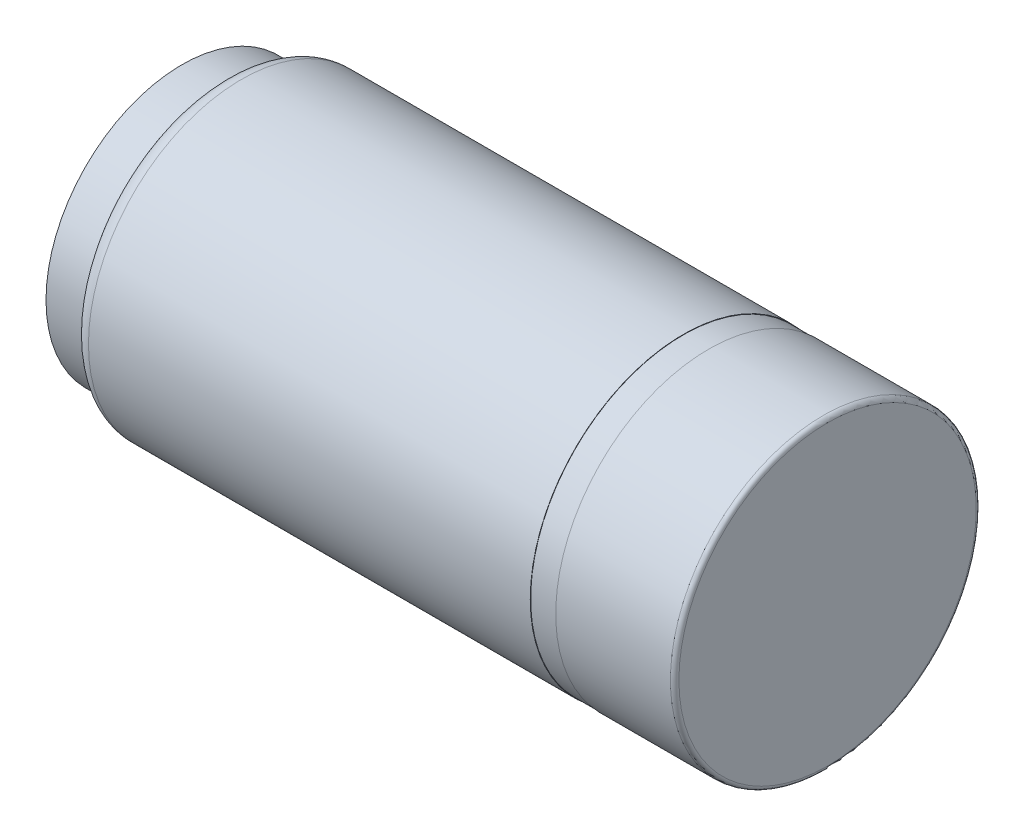
ISO-10303-21;
HEADER;
FILE_DESCRIPTION(('STEP AP214'),'2;1');
FILE_NAME('part.step','',(''),(''),'','','');
FILE_SCHEMA(('AUTOMOTIVE_DESIGN { 1 0 10303 214 1 1 1 1 }'));
ENDSEC;
DATA;
#1=APPLICATION_CONTEXT('core data for automotive mechanical design processes');
#2=APPLICATION_PROTOCOL_DEFINITION('international standard','automotive_design',2000,#1);
#3=PRODUCT_CONTEXT('',#1,'mechanical');
#4=PRODUCT('Part','Part','',(#3));
#5=PRODUCT_RELATED_PRODUCT_CATEGORY('part','',(#4));
#6=PRODUCT_DEFINITION_FORMATION('','',#4);
#7=PRODUCT_DEFINITION_CONTEXT('part definition',#1,'design');
#8=PRODUCT_DEFINITION('design','',#6,#7);
#9=PRODUCT_DEFINITION_SHAPE('','',#8);
#10=(LENGTH_UNIT() NAMED_UNIT(*) SI_UNIT(.MILLI.,.METRE.));
#11=(NAMED_UNIT(*) PLANE_ANGLE_UNIT() SI_UNIT($,.RADIAN.));
#12=(NAMED_UNIT(*) SI_UNIT($,.STERADIAN.) SOLID_ANGLE_UNIT());
#13=UNCERTAINTY_MEASURE_WITH_UNIT(LENGTH_MEASURE(1.E-05),#10,'distance_accuracy_value','');
#14=(GEOMETRIC_REPRESENTATION_CONTEXT(3) GLOBAL_UNCERTAINTY_ASSIGNED_CONTEXT((#13)) GLOBAL_UNIT_ASSIGNED_CONTEXT((#10,
#11,#12)) REPRESENTATION_CONTEXT('',''));
#15=CARTESIAN_POINT('',(0.,0.,0.));
#16=DIRECTION('',(0.,0.,1.));
#17=DIRECTION('',(1.,0.,0.));
#18=AXIS2_PLACEMENT_3D('',#15,#16,#17);
#19=CARTESIAN_POINT('',(0.,0.,0.));
#20=DIRECTION('',(-1.,0.,0.));
#21=DIRECTION('',(0.,0.,1.));
#22=AXIS2_PLACEMENT_3D('',#19,#20,#21);
#23=CYLINDRICAL_SURFACE('',#22,18.);
#24=CARTESIAN_POINT('',(101.3,0.,0.));
#25=DIRECTION('',(1.,0.,0.));
#26=DIRECTION('',(0.,0.,-1.));
#27=AXIS2_PLACEMENT_3D('',#24,#25,#26);
#28=CIRCLE('',#27,18.);
#29=CARTESIAN_POINT('',(101.3,0.,-18.));
#30=VERTEX_POINT('',#29);
#31=EDGE_CURVE('E64',#30,#30,#28,.T.);
#32=ORIENTED_EDGE('',*,*,#31,.F.);
#33=EDGE_LOOP('',(#32));
#34=FACE_BOUND('',#33,.T.);
#35=CARTESIAN_POINT('',(49.3,0.,0.));
#36=DIRECTION('',(-1.,0.,0.));
#37=DIRECTION('',(0.,0.,1.));
#38=AXIS2_PLACEMENT_3D('',#35,#36,#37);
#39=CIRCLE('',#38,18.);
#40=CARTESIAN_POINT('',(49.3,0.,18.));
#41=VERTEX_POINT('',#40);
#42=EDGE_CURVE('E49',#41,#41,#39,.T.);
#43=ORIENTED_EDGE('',*,*,#42,.F.);
#44=EDGE_LOOP('',(#43));
#45=FACE_BOUND('',#44,.T.);
#46=ADVANCED_FACE('F38',(#34,#45),#23,.T.);
#47=CARTESIAN_POINT('',(49.3,0.,0.));
#48=DIRECTION('',(-1.,0.,0.));
#49=DIRECTION('',(0.,0.,1.));
#50=AXIS2_PLACEMENT_3D('',#47,#48,#49);
#51=TOROIDAL_SURFACE('',#50,16.,2.);
#52=ORIENTED_EDGE('',*,*,#42,.T.);
#53=EDGE_LOOP('',(#52));
#54=FACE_BOUND('',#53,.T.);
#55=CARTESIAN_POINT('',(47.3,0.,0.));
#56=DIRECTION('',(-1.,0.,0.));
#57=DIRECTION('',(0.,0.,1.));
#58=AXIS2_PLACEMENT_3D('',#55,#56,#57);
#59=CIRCLE('',#58,16.);
#60=CARTESIAN_POINT('',(47.3,0.,16.));
#61=VERTEX_POINT('',#60);
#62=EDGE_CURVE('E53',#61,#61,#59,.T.);
#63=ORIENTED_EDGE('',*,*,#62,.F.);
#64=EDGE_LOOP('',(#63));
#65=FACE_BOUND('',#64,.T.);
#66=ADVANCED_FACE('F86',(#54,#65),#51,.T.);
#67=CARTESIAN_POINT('',(0.,0.,0.));
#68=DIRECTION('',(-1.,0.,0.));
#69=DIRECTION('',(0.,0.,1.));
#70=AXIS2_PLACEMENT_3D('',#67,#68,#69);
#71=CYLINDRICAL_SURFACE('',#70,16.);
#72=ORIENTED_EDGE('',*,*,#62,.T.);
#73=EDGE_LOOP('',(#72));
#74=FACE_BOUND('',#73,.T.);
#75=CARTESIAN_POINT('',(42.3,0.,0.));
#76=DIRECTION('',(-1.,0.,0.));
#77=DIRECTION('',(0.,0.,1.));
#78=AXIS2_PLACEMENT_3D('',#75,#76,#77);
#79=CIRCLE('',#78,16.);
#80=CARTESIAN_POINT('',(42.3,0.,16.));
#81=VERTEX_POINT('',#80);
#82=EDGE_CURVE('E70',#81,#81,#79,.F.);
#83=ORIENTED_EDGE('',*,*,#82,.T.);
#84=EDGE_LOOP('',(#83));
#85=FACE_BOUND('',#84,.T.);
#86=ADVANCED_FACE('F74',(#74,#85),#71,.T.);
#87=CARTESIAN_POINT('',(103.004702910894,0.,0.));
#88=DIRECTION('',(1.,0.,0.));
#89=DIRECTION('',(0.,0.,-1.));
#90=AXIS2_PLACEMENT_3D('',#87,#88,#89);
#91=CYLINDRICAL_SURFACE('',#90,17.95);
#92=CARTESIAN_POINT('',(104.3,0.,0.));
#93=DIRECTION('',(1.,0.,0.));
#94=DIRECTION('',(0.,0.,-1.));
#95=AXIS2_PLACEMENT_3D('',#92,#93,#94);
#96=CIRCLE('',#95,17.95);
#97=CARTESIAN_POINT('',(104.3,0.,-17.95));
#98=VERTEX_POINT('',#97);
#99=EDGE_CURVE('E58',#98,#98,#96,.T.);
#100=ORIENTED_EDGE('',*,*,#99,.F.);
#101=EDGE_LOOP('',(#100));
#102=FACE_BOUND('',#101,.T.);
#103=CARTESIAN_POINT('',(101.3,0.,0.));
#104=DIRECTION('',(1.,0.,0.));
#105=DIRECTION('',(0.,0.,-1.));
#106=AXIS2_PLACEMENT_3D('',#103,#104,#105);
#107=CIRCLE('',#106,17.95);
#108=CARTESIAN_POINT('',(101.3,0.,-17.95));
#109=VERTEX_POINT('',#108);
#110=EDGE_CURVE('E61',#109,#109,#107,.T.);
#111=ORIENTED_EDGE('',*,*,#110,.T.);
#112=EDGE_LOOP('',(#111));
#113=FACE_BOUND('',#112,.T.);
#114=ADVANCED_FACE('F98',(#102,#113),#91,.T.);
#115=CARTESIAN_POINT('',(101.3,0.,-18.));
#116=DIRECTION('',(-1.,0.,0.));
#117=DIRECTION('',(0.,0.,1.));
#118=AXIS2_PLACEMENT_3D('',#115,#116,#117);
#119=PLANE('',#118);
#120=ORIENTED_EDGE('',*,*,#110,.F.);
#121=EDGE_LOOP('',(#120));
#122=FACE_BOUND('',#121,.T.);
#123=ORIENTED_EDGE('',*,*,#31,.T.);
#124=EDGE_LOOP('',(#123));
#125=FACE_BOUND('',#124,.T.);
#126=ADVANCED_FACE('F102',(#122,#125),#119,.F.);
#127=CARTESIAN_POINT('',(104.3,0.,0.));
#128=DIRECTION('',(1.,0.,0.));
#129=DIRECTION('',(0.,0.,-1.));
#130=AXIS2_PLACEMENT_3D('',#127,#128,#129);
#131=PLANE('',#130);
#132=CARTESIAN_POINT('',(104.3,0.,0.));
#133=DIRECTION('',(1.,0.,0.));
#134=DIRECTION('',(0.,0.,-1.));
#135=AXIS2_PLACEMENT_3D('',#132,#133,#134);
#136=CIRCLE('',#135,18.);
#137=CARTESIAN_POINT('',(104.3,0.,-18.));
#138=VERTEX_POINT('',#137);
#139=EDGE_CURVE('E67',#138,#138,#136,.T.);
#140=ORIENTED_EDGE('',*,*,#139,.F.);
#141=EDGE_LOOP('',(#140));
#142=FACE_BOUND('',#141,.T.);
#143=ORIENTED_EDGE('',*,*,#99,.T.);
#144=EDGE_LOOP('',(#143));
#145=FACE_BOUND('',#144,.T.);
#146=ADVANCED_FACE('F106',(#142,#145),#131,.F.);
#147=CARTESIAN_POINT('',(118.3,0.,0.));
#148=DIRECTION('',(-1.,0.,0.));
#149=DIRECTION('',(0.,0.,1.));
#150=AXIS2_PLACEMENT_3D('',#147,#148,#149);
#151=CYLINDRICAL_SURFACE('',#150,18.);
#152=CARTESIAN_POINT('',(117.8,0.,0.));
#153=DIRECTION('',(1.,0.,0.));
#154=DIRECTION('',(0.,0.,-1.));
#155=AXIS2_PLACEMENT_3D('',#152,#153,#154);
#156=CIRCLE('',#155,18.);
#157=CARTESIAN_POINT('',(117.8,0.,-18.));
#158=VERTEX_POINT('',#157);
#159=EDGE_CURVE('E10',#158,#158,#156,.F.);
#160=ORIENTED_EDGE('',*,*,#159,.T.);
#161=EDGE_LOOP('',(#160));
#162=FACE_BOUND('',#161,.T.);
#163=ORIENTED_EDGE('',*,*,#139,.T.);
#164=EDGE_LOOP('',(#163));
#165=FACE_BOUND('',#164,.T.);
#166=ADVANCED_FACE('F108',(#162,#165),#151,.T.);
#167=CARTESIAN_POINT('',(118.3,0.,0.));
#168=DIRECTION('',(1.,0.,0.));
#169=DIRECTION('',(0.,0.,-1.));
#170=AXIS2_PLACEMENT_3D('',#167,#168,#169);
#171=PLANE('',#170);
#172=CARTESIAN_POINT('',(118.3,0.,0.));
#173=DIRECTION('',(1.,0.,0.));
#174=DIRECTION('',(0.,0.,-1.));
#175=AXIS2_PLACEMENT_3D('',#172,#173,#174);
#176=CIRCLE('',#175,17.5);
#177=CARTESIAN_POINT('',(118.3,0.,-17.5));
#178=VERTEX_POINT('',#177);
#179=EDGE_CURVE('E45',#178,#178,#176,.T.);
#180=ORIENTED_EDGE('',*,*,#179,.T.);
#181=EDGE_LOOP('',(#180));
#182=FACE_BOUND('',#181,.T.);
#183=ADVANCED_FACE('F82',(#182),#171,.T.);
#184=CARTESIAN_POINT('',(117.8,0.,0.));
#185=DIRECTION('',(1.,0.,0.));
#186=DIRECTION('',(0.,0.,-1.));
#187=AXIS2_PLACEMENT_3D('',#184,#185,#186);
#188=TOROIDAL_SURFACE('',#187,17.5,0.5);
#189=ORIENTED_EDGE('',*,*,#159,.F.);
#190=EDGE_LOOP('',(#189));
#191=FACE_BOUND('',#190,.T.);
#192=ORIENTED_EDGE('',*,*,#179,.F.);
#193=EDGE_LOOP('',(#192));
#194=FACE_BOUND('',#193,.T.);
#195=ADVANCED_FACE('F40',(#191,#194),#188,.T.);
#196=CARTESIAN_POINT('',(42.3,0.,0.));
#197=DIRECTION('',(-1.,0.,0.));
#198=DIRECTION('',(0.,0.,1.));
#199=AXIS2_PLACEMENT_3D('',#196,#197,#198);
#200=PLANE('',#199);
#201=ORIENTED_EDGE('',*,*,#82,.F.);
#202=EDGE_LOOP('',(#201));
#203=FACE_BOUND('',#202,.T.);
#204=ADVANCED_FACE('F76',(#203),#200,.T.);
#205=CLOSED_SHELL('',(#46,#66,#86,#114,#126,#146,#166,#183,#195,#204));
#206=MANIFOLD_SOLID_BREP('B2',#205);
#207=ADVANCED_BREP_SHAPE_REPRESENTATION('',(#18,#206),#14);
#208=SHAPE_DEFINITION_REPRESENTATION(#9,#207);
ENDSEC;
END-ISO-10303-21;
